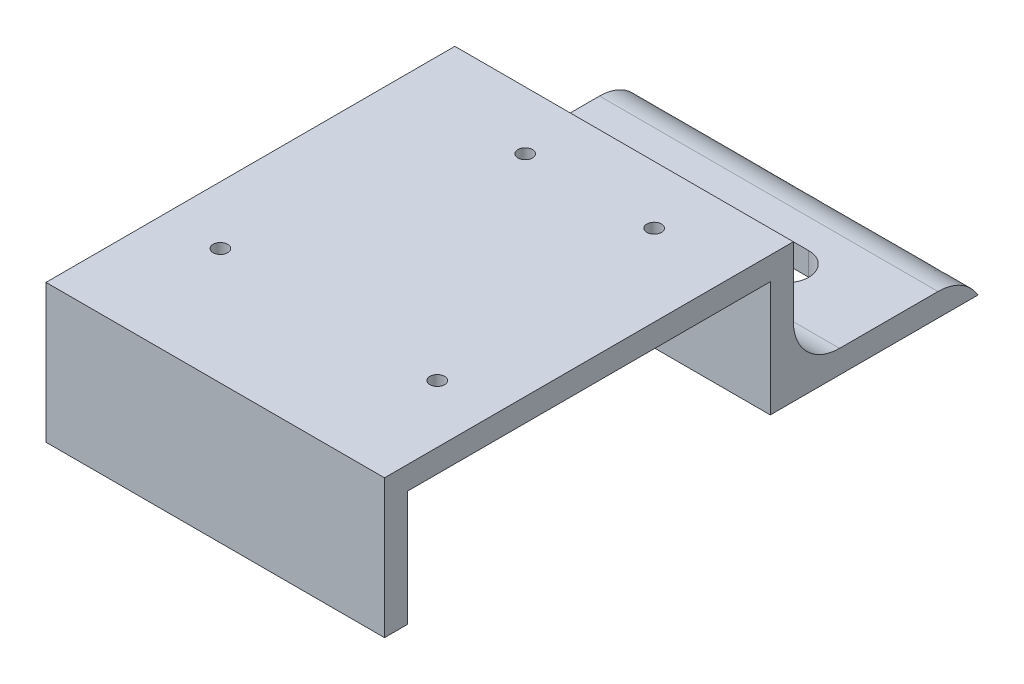
ISO-10303-21;
HEADER;
FILE_DESCRIPTION(('STEP AP214'),'2;1');
FILE_NAME('part.step','',(''),(''),'','','');
FILE_SCHEMA(('AUTOMOTIVE_DESIGN { 1 0 10303 214 1 1 1 1 }'));
ENDSEC;
DATA;
#1=APPLICATION_CONTEXT('core data for automotive mechanical design processes');
#2=APPLICATION_PROTOCOL_DEFINITION('international standard','automotive_design',2000,#1);
#3=PRODUCT_CONTEXT('',#1,'mechanical');
#4=PRODUCT('Part','Part','',(#3));
#5=PRODUCT_RELATED_PRODUCT_CATEGORY('part','',(#4));
#6=PRODUCT_DEFINITION_FORMATION('','',#4);
#7=PRODUCT_DEFINITION_CONTEXT('part definition',#1,'design');
#8=PRODUCT_DEFINITION('design','',#6,#7);
#9=PRODUCT_DEFINITION_SHAPE('','',#8);
#10=(LENGTH_UNIT() NAMED_UNIT(*) SI_UNIT(.MILLI.,.METRE.));
#11=(NAMED_UNIT(*) PLANE_ANGLE_UNIT() SI_UNIT($,.RADIAN.));
#12=(NAMED_UNIT(*) SI_UNIT($,.STERADIAN.) SOLID_ANGLE_UNIT());
#13=UNCERTAINTY_MEASURE_WITH_UNIT(LENGTH_MEASURE(1.E-05),#10,'distance_accuracy_value','');
#14=(GEOMETRIC_REPRESENTATION_CONTEXT(3) GLOBAL_UNCERTAINTY_ASSIGNED_CONTEXT((#13)) GLOBAL_UNIT_ASSIGNED_CONTEXT((#10,
#11,#12)) REPRESENTATION_CONTEXT('',''));
#15=CARTESIAN_POINT('',(0.,0.,0.));
#16=DIRECTION('',(0.,0.,1.));
#17=DIRECTION('',(1.,0.,0.));
#18=AXIS2_PLACEMENT_3D('',#15,#16,#17);
#19=CARTESIAN_POINT('',(10.,5.,-78.58));
#20=DIRECTION('',(0.,0.,1.));
#21=DIRECTION('',(1.,0.,0.));
#22=AXIS2_PLACEMENT_3D('',#19,#20,#21);
#23=PLANE('',#22);
#24=DIRECTION('',(0.,-1.,0.));
#25=VECTOR('',#24,1.);
#26=CARTESIAN_POINT('',(10.,5.,-78.58));
#27=LINE('',#26,#25);
#28=CARTESIAN_POINT('',(10.,5.,-78.58));
#29=VERTEX_POINT('',#28);
#30=CARTESIAN_POINT('',(10.,-10.,-78.58));
#31=VERTEX_POINT('',#30);
#32=EDGE_CURVE('E308',#29,#31,#27,.T.);
#33=ORIENTED_EDGE('',*,*,#32,.T.);
#34=CARTESIAN_POINT('',(-210.02,-9.99999999999999,-78.58));
#35=CARTESIAN_POINT('',(-161.126666666667,-10.,-78.58));
#36=CARTESIAN_POINT('',(-112.233333333333,-10.,-78.58));
#37=CARTESIAN_POINT('',(-63.34,-10.,-78.58));
#38=CARTESIAN_POINT('',(-38.8933333333333,-10.,-78.58));
#39=CARTESIAN_POINT('',(-14.4466666666667,-10.,-78.58));
#40=CARTESIAN_POINT('',(10.,-10.,-78.58));
#41=CARTESIAN_POINT('',(58.8933333333334,-10.,-78.58));
#42=CARTESIAN_POINT('',(107.786666666667,-10.,-78.58));
#43=CARTESIAN_POINT('',(156.68,-10.,-78.58));
#44=(BOUNDED_CURVE() B_SPLINE_CURVE(3,(#34,#35,#36,#37,#38,#39,#40,#41,#42,#43),.UNSPECIFIED.,
.F.,.F.) B_SPLINE_CURVE_WITH_KNOTS((4,3,3,4),(-0.22002,-0.07334,0.,0.14668),
.UNSPECIFIED.) CURVE() GEOMETRIC_REPRESENTATION_ITEM() RATIONAL_B_SPLINE_CURVE((1.,1.,1.,1.,1.,
1.,1.,1.,1.,1.)) REPRESENTATION_ITEM(''));
#45=CARTESIAN_POINT('',(-63.34,-10.,-78.58));
#46=VERTEX_POINT('',#45);
#47=EDGE_CURVE('E68',#31,#46,#44,.F.);
#48=ORIENTED_EDGE('',*,*,#47,.T.);
#49=DIRECTION('',(0.,-1.,0.));
#50=VECTOR('',#49,1.);
#51=CARTESIAN_POINT('',(-63.34,5.,-78.58));
#52=LINE('',#51,#50);
#53=CARTESIAN_POINT('',(-63.34,5.,-78.58));
#54=VERTEX_POINT('',#53);
#55=EDGE_CURVE('E312',#54,#46,#52,.T.);
#56=ORIENTED_EDGE('',*,*,#55,.F.);
#57=DIRECTION('',(-1.,0.,0.));
#58=VECTOR('',#57,1.);
#59=CARTESIAN_POINT('',(10.,5.,-78.58));
#60=LINE('',#59,#58);
#61=EDGE_CURVE('E309',#29,#54,#60,.T.);
#62=ORIENTED_EDGE('',*,*,#61,.F.);
#63=EDGE_LOOP('',(#33,#48,#56,#62));
#64=FACE_BOUND('',#63,.T.);
#65=ADVANCED_FACE('F38',(#64),#23,.F.);
#66=CARTESIAN_POINT('',(0.,0.,0.));
#67=DIRECTION('',(0.,-1.,0.));
#68=DIRECTION('',(0.,0.,-1.));
#69=AXIS2_PLACEMENT_3D('',#66,#67,#68);
#70=PLANE('',#69);
#71=CARTESIAN_POINT('',(-50.8,0.,-15.24));
#72=DIRECTION('',(0.,1.,0.));
#73=DIRECTION('',(0.,0.,1.));
#74=AXIS2_PLACEMENT_3D('',#71,#72,#73);
#75=CIRCLE('',#74,1.5875);
#76=CARTESIAN_POINT('',(-50.8,0.,-13.6525));
#77=VERTEX_POINT('',#76);
#78=EDGE_CURVE('E383',#77,#77,#75,.T.);
#79=ORIENTED_EDGE('',*,*,#78,.T.);
#80=EDGE_LOOP('',(#79));
#81=FACE_BOUND('',#80,.T.);
#82=CARTESIAN_POINT('',(-2.54,0.,-13.97));
#83=DIRECTION('',(0.,1.,0.));
#84=DIRECTION('',(0.,0.,1.));
#85=AXIS2_PLACEMENT_3D('',#82,#83,#84);
#86=CIRCLE('',#85,1.5875);
#87=CARTESIAN_POINT('',(-2.54,0.,-12.3825));
#88=VERTEX_POINT('',#87);
#89=EDGE_CURVE('E388',#88,#88,#86,.T.);
#90=ORIENTED_EDGE('',*,*,#89,.T.);
#91=EDGE_LOOP('',(#90));
#92=FACE_BOUND('',#91,.T.);
#93=CARTESIAN_POINT('',(-35.56,0.,-66.04));
#94=DIRECTION('',(0.,1.,0.));
#95=DIRECTION('',(0.,0.,1.));
#96=AXIS2_PLACEMENT_3D('',#93,#94,#95);
#97=CIRCLE('',#96,1.5875);
#98=CARTESIAN_POINT('',(-35.56,0.,-64.4525));
#99=VERTEX_POINT('',#98);
#100=EDGE_CURVE('E384',#99,#99,#97,.T.);
#101=ORIENTED_EDGE('',*,*,#100,.T.);
#102=EDGE_LOOP('',(#101));
#103=FACE_BOUND('',#102,.T.);
#104=CARTESIAN_POINT('',(-7.62,0.,-66.04));
#105=DIRECTION('',(0.,1.,0.));
#106=DIRECTION('',(0.,0.,1.));
#107=AXIS2_PLACEMENT_3D('',#104,#105,#106);
#108=CIRCLE('',#107,1.5875);
#109=CARTESIAN_POINT('',(-7.62,0.,-64.4525));
#110=VERTEX_POINT('',#109);
#111=EDGE_CURVE('E387',#110,#110,#108,.T.);
#112=ORIENTED_EDGE('',*,*,#111,.T.);
#113=EDGE_LOOP('',(#112));
#114=FACE_BOUND('',#113,.T.);
#115=DIRECTION('',(0.,0.,-1.));
#116=VECTOR('',#115,1.);
#117=CARTESIAN_POINT('',(10.,0.,10.));
#118=LINE('',#117,#116);
#119=CARTESIAN_POINT('',(10.,0.,5.00000000000001));
#120=VERTEX_POINT('',#119);
#121=CARTESIAN_POINT('',(10.,0.,-73.58));
#122=VERTEX_POINT('',#121);
#123=EDGE_CURVE('E412',#120,#122,#118,.T.);
#124=ORIENTED_EDGE('',*,*,#123,.F.);
#125=DIRECTION('',(1.,0.,0.));
#126=VECTOR('',#125,1.);
#127=CARTESIAN_POINT('',(-63.34,0.,5.00000000000001));
#128=LINE('',#127,#126);
#129=CARTESIAN_POINT('',(-63.34,0.,5.00000000000001));
#130=VERTEX_POINT('',#129);
#131=EDGE_CURVE('E324',#130,#120,#128,.T.);
#132=ORIENTED_EDGE('',*,*,#131,.F.);
#133=DIRECTION('',(0.,0.,-1.));
#134=VECTOR('',#133,1.);
#135=CARTESIAN_POINT('',(-63.34,0.,10.));
#136=LINE('',#135,#134);
#137=CARTESIAN_POINT('',(-63.34,0.,-73.58));
#138=VERTEX_POINT('',#137);
#139=EDGE_CURVE('E407',#130,#138,#136,.T.);
#140=ORIENTED_EDGE('',*,*,#139,.T.);
#141=DIRECTION('',(-1.,0.,0.));
#142=VECTOR('',#141,1.);
#143=CARTESIAN_POINT('',(-63.34,0.,-73.58));
#144=LINE('',#143,#142);
#145=EDGE_CURVE('E371',#122,#138,#144,.T.);
#146=ORIENTED_EDGE('',*,*,#145,.F.);
#147=EDGE_LOOP('',(#124,#132,#140,#146));
#148=FACE_BOUND('',#147,.T.);
#149=ADVANCED_FACE('F232',(#81,#92,#103,#114,#148),#70,.T.);
#150=CARTESIAN_POINT('',(10.,5.,10.));
#151=DIRECTION('',(0.,0.,1.));
#152=DIRECTION('',(1.,0.,0.));
#153=AXIS2_PLACEMENT_3D('',#150,#151,#152);
#154=PLANE('',#153);
#155=DIRECTION('',(0.,-1.,0.));
#156=VECTOR('',#155,1.);
#157=CARTESIAN_POINT('',(-63.34,5.,10.));
#158=LINE('',#157,#156);
#159=CARTESIAN_POINT('',(-63.34,5.,10.));
#160=VERTEX_POINT('',#159);
#161=CARTESIAN_POINT('',(-63.34,-25.,10.));
#162=VERTEX_POINT('',#161);
#163=EDGE_CURVE('E208',#160,#162,#158,.T.);
#164=ORIENTED_EDGE('',*,*,#163,.T.);
#165=DIRECTION('',(-1.,0.,0.));
#166=VECTOR('',#165,1.);
#167=CARTESIAN_POINT('',(10.,-25.,10.));
#168=LINE('',#167,#166);
#169=CARTESIAN_POINT('',(10.,-25.,10.));
#170=VERTEX_POINT('',#169);
#171=EDGE_CURVE('E327',#170,#162,#168,.T.);
#172=ORIENTED_EDGE('',*,*,#171,.F.);
#173=DIRECTION('',(0.,-1.,0.));
#174=VECTOR('',#173,1.);
#175=CARTESIAN_POINT('',(10.,5.,10.));
#176=LINE('',#175,#174);
#177=CARTESIAN_POINT('',(10.,5.,10.));
#178=VERTEX_POINT('',#177);
#179=EDGE_CURVE('E311',#178,#170,#176,.T.);
#180=ORIENTED_EDGE('',*,*,#179,.F.);
#181=DIRECTION('',(-1.,0.,0.));
#182=VECTOR('',#181,1.);
#183=CARTESIAN_POINT('',(10.,5.,10.));
#184=LINE('',#183,#182);
#185=EDGE_CURVE('E408',#178,#160,#184,.T.);
#186=ORIENTED_EDGE('',*,*,#185,.T.);
#187=EDGE_LOOP('',(#164,#172,#180,#186));
#188=FACE_BOUND('',#187,.T.);
#189=ADVANCED_FACE('F231',(#188),#154,.T.);
#190=CARTESIAN_POINT('',(10.,5.,10.));
#191=DIRECTION('',(-1.,0.,0.));
#192=DIRECTION('',(0.,0.,1.));
#193=AXIS2_PLACEMENT_3D('',#190,#191,#192);
#194=PLANE('',#193);
#195=DIRECTION('',(0.,0.,1.));
#196=VECTOR('',#195,1.);
#197=CARTESIAN_POINT('',(10.,-25.,-73.58));
#198=LINE('',#197,#196);
#199=CARTESIAN_POINT('',(9.99999999999999,-25.,-118.58));
#200=VERTEX_POINT('',#199);
#201=CARTESIAN_POINT('',(10.,-25.,-73.58));
#202=VERTEX_POINT('',#201);
#203=EDGE_CURVE('E218',#200,#202,#198,.T.);
#204=ORIENTED_EDGE('',*,*,#203,.F.);
#205=CARTESIAN_POINT('',(10.,-20.,-109.919745962156));
#206=CARTESIAN_POINT('',(9.99999999999999,-20.,-115.693248654052));
#207=CARTESIAN_POINT('',(9.99999999999999,-25.,-118.58));
#208=(BOUNDED_CURVE() B_SPLINE_CURVE(2,(#205,#206,#207),.UNSPECIFIED.,.F.,
.F.) B_SPLINE_CURVE_WITH_KNOTS((3,3),(0.,1.),
.UNSPECIFIED.) CURVE() GEOMETRIC_REPRESENTATION_ITEM() RATIONAL_B_SPLINE_CURVE((1.,
0.866025403784439,1.)) REPRESENTATION_ITEM(''));
#209=CARTESIAN_POINT('',(9.99999999999999,-20.,-109.919745962156));
#210=VERTEX_POINT('',#209);
#211=EDGE_CURVE('E212',#200,#210,#208,.F.);
#212=ORIENTED_EDGE('',*,*,#211,.T.);
#213=DIRECTION('',(0.,0.,1.));
#214=VECTOR('',#213,1.);
#215=CARTESIAN_POINT('',(9.99999999999999,-20.,-118.58));
#216=LINE('',#215,#214);
#217=CARTESIAN_POINT('',(10.,-20.,-88.58));
#218=VERTEX_POINT('',#217);
#219=EDGE_CURVE('E204',#210,#218,#216,.T.);
#220=ORIENTED_EDGE('',*,*,#219,.T.);
#221=CARTESIAN_POINT('',(10.,-20.,-88.58));
#222=CARTESIAN_POINT('',(10.,-20.000030243782,-88.2987394086294));
#223=CARTESIAN_POINT('',(10.,-19.9881351412365,-88.0174831608804));
#224=CARTESIAN_POINT('',(10.,-19.9407126842738,-87.4569829879485));
#225=CARTESIAN_POINT('',(10.,-19.9051864634849,-87.177738966885));
#226=CARTESIAN_POINT('',(10.,-19.8107558621721,-86.6234490123563));
#227=CARTESIAN_POINT('',(10.,-19.7518691668823,-86.3484000661787));
#228=CARTESIAN_POINT('',(10.,-19.6111459958113,-85.8042409682999));
#229=CARTESIAN_POINT('',(10.,-19.529309800179,-85.535130744147));
#230=CARTESIAN_POINT('',(10.,-19.3432216940754,-85.004630965642));
#231=CARTESIAN_POINT('',(10.,-19.2389591118716,-84.7432451545858));
#232=CARTESIAN_POINT('',(10.,-19.0087808876758,-84.2301813919526));
#233=CARTESIAN_POINT('',(10.,-18.8828647877046,-83.9785036458424));
#234=CARTESIAN_POINT('',(10.,-18.610301372502,-83.4866968361682));
#235=CARTESIAN_POINT('',(10.,-18.4636578817249,-83.2465656530534));
#236=CARTESIAN_POINT('',(10.,-18.1506654585722,-82.7795105128233));
#237=CARTESIAN_POINT('',(10.,-17.9843166323574,-82.5525864845653));
#238=CARTESIAN_POINT('',(10.,-17.6330965634878,-82.1135588232172));
#239=CARTESIAN_POINT('',(10.,-17.4482254522391,-81.9014550850028));
#240=CARTESIAN_POINT('',(10.,-17.0612739280054,-81.4935738749011));
#241=CARTESIAN_POINT('',(10.,-16.8591935146296,-81.2977964033847));
#242=CARTESIAN_POINT('',(10.,-16.4392168814837,-80.9239212007128));
#243=CARTESIAN_POINT('',(10.,-16.2213174490276,-80.745827078357));
#244=CARTESIAN_POINT('',(10.,-15.7712923694028,-80.4086329512801));
#245=CARTESIAN_POINT('',(10.,-15.5391669412312,-80.2495326542764));
#246=CARTESIAN_POINT('',(10.,-15.0622858327539,-79.9514225883191));
#247=CARTESIAN_POINT('',(10.,-14.8175274854212,-79.8124170854607));
#248=CARTESIAN_POINT('',(10.,-14.3171746784549,-79.5555280479117));
#249=CARTESIAN_POINT('',(10.,-14.0615803993028,-79.4376441615938));
#250=CARTESIAN_POINT('',(10.,-13.5414762201447,-79.2238821155476));
#251=CARTESIAN_POINT('',(10.,-13.2769704678346,-79.127993876253));
#252=CARTESIAN_POINT('',(10.,-12.7409265033633,-78.9588596600932));
#253=CARTESIAN_POINT('',(10.,-12.4693899987335,-78.8856082403888));
#254=CARTESIAN_POINT('',(10.,-11.8350735853804,-78.7428974788904));
#255=CARTESIAN_POINT('',(10.,-11.4703549279125,-78.6818129448116));
#256=CARTESIAN_POINT('',(10.,-10.9203488802216,-78.6207323685772));
#257=CARTESIAN_POINT('',(10.,-10.7366189268432,-78.6054632274793));
#258=CARTESIAN_POINT('',(10.,-10.3686077135829,-78.5850982707273));
#259=CARTESIAN_POINT('',(10.,-10.1843264895054,-78.5800018081456));
#260=CARTESIAN_POINT('',(10.,-10.,-78.58));
#261=B_SPLINE_CURVE_WITH_KNOTS('',3,(#221,#222,#223,#224,#225,#226,#227,#228,#229,#230,#231,
#232,#233,#234,#235,#236,#237,#238,#239,#240,#241,#242,#243,#244,#245,#246,#247,#248,#249,#250,
#251,#252,#253,#254,#255,#256,#257,#258,#259,#260),.UNSPECIFIED.,.F.,.F.,(4,2,2,2,2,2,2,2,2,2,2,
2,2,2,2,2,2,2,2,4),(0.,0.843524225534214,1.68700798857623,2.52985440039547,3.37269052387659,
4.21592860686618,5.05918452682156,5.90228505847174,6.74538104819433,7.58847105701002,
8.43156108497183,9.27482281775598,10.1180715725067,10.9614990856436,11.804912556303,
12.6479387548296,13.4907620965666,14.5975846256286,15.1504384772058,15.7032571691341),.UNSPECIFIED.);
#262=EDGE_CURVE('E55',#218,#31,#261,.T.);
#263=ORIENTED_EDGE('',*,*,#262,.T.);
#264=ORIENTED_EDGE('',*,*,#32,.F.);
#265=DIRECTION('',(0.,0.,-1.));
#266=VECTOR('',#265,1.);
#267=CARTESIAN_POINT('',(10.,5.,10.));
#268=LINE('',#267,#266);
#269=EDGE_CURVE('E415',#178,#29,#268,.T.);
#270=ORIENTED_EDGE('',*,*,#269,.F.);
#271=ORIENTED_EDGE('',*,*,#179,.T.);
#272=DIRECTION('',(0.,0.,1.));
#273=VECTOR('',#272,1.);
#274=CARTESIAN_POINT('',(10.,-25.,5.00000000000001));
#275=LINE('',#274,#273);
#276=CARTESIAN_POINT('',(10.,-25.,5.00000000000001));
#277=VERTEX_POINT('',#276);
#278=EDGE_CURVE('E360',#277,#170,#275,.T.);
#279=ORIENTED_EDGE('',*,*,#278,.F.);
#280=DIRECTION('',(0.,1.,0.));
#281=VECTOR('',#280,1.);
#282=CARTESIAN_POINT('',(10.,-25.,5.00000000000001));
#283=LINE('',#282,#281);
#284=EDGE_CURVE('E366',#277,#120,#283,.T.);
#285=ORIENTED_EDGE('',*,*,#284,.T.);
#286=ORIENTED_EDGE('',*,*,#123,.T.);
#287=DIRECTION('',(0.,1.,0.));
#288=VECTOR('',#287,1.);
#289=CARTESIAN_POINT('',(10.,-25.,-73.58));
#290=LINE('',#289,#288);
#291=EDGE_CURVE('E380',#202,#122,#290,.T.);
#292=ORIENTED_EDGE('',*,*,#291,.F.);
#293=EDGE_LOOP('',(#204,#212,#220,#263,#264,#270,#271,#279,#285,#286,#292));
#294=FACE_BOUND('',#293,.T.);
#295=ADVANCED_FACE('F220',(#294),#194,.F.);
#296=CARTESIAN_POINT('',(-63.34,5.,10.));
#297=DIRECTION('',(-1.,0.,0.));
#298=DIRECTION('',(0.,0.,1.));
#299=AXIS2_PLACEMENT_3D('',#296,#297,#298);
#300=PLANE('',#299);
#301=DIRECTION('',(0.,0.,1.));
#302=VECTOR('',#301,1.);
#303=CARTESIAN_POINT('',(-63.34,-20.,-118.58));
#304=LINE('',#303,#302);
#305=CARTESIAN_POINT('',(-63.34,-20.,-109.919745962156));
#306=VERTEX_POINT('',#305);
#307=CARTESIAN_POINT('',(-63.34,-20.,-88.58));
#308=VERTEX_POINT('',#307);
#309=EDGE_CURVE('E207',#306,#308,#304,.T.);
#310=ORIENTED_EDGE('',*,*,#309,.F.);
#311=CARTESIAN_POINT('',(-63.34,-25.,-118.58));
#312=CARTESIAN_POINT('',(-63.34,-20.,-115.693248654052));
#313=CARTESIAN_POINT('',(-63.34,-20.,-109.919745962156));
#314=(BOUNDED_CURVE() B_SPLINE_CURVE(2,(#311,#312,#313),.UNSPECIFIED.,.F.,
.F.) B_SPLINE_CURVE_WITH_KNOTS((3,3),(0.,1.),
.UNSPECIFIED.) CURVE() GEOMETRIC_REPRESENTATION_ITEM() RATIONAL_B_SPLINE_CURVE((1.,
0.866025403784439,1.)) REPRESENTATION_ITEM(''));
#315=CARTESIAN_POINT('',(-63.34,-25.,-118.58));
#316=VERTEX_POINT('',#315);
#317=EDGE_CURVE('E251',#306,#316,#314,.F.);
#318=ORIENTED_EDGE('',*,*,#317,.T.);
#319=DIRECTION('',(0.,0.,-1.));
#320=VECTOR('',#319,1.);
#321=CARTESIAN_POINT('',(-63.34,-25.,-78.58));
#322=LINE('',#321,#320);
#323=CARTESIAN_POINT('',(-63.34,-25.,-73.58));
#324=VERTEX_POINT('',#323);
#325=EDGE_CURVE('E374',#324,#316,#322,.T.);
#326=ORIENTED_EDGE('',*,*,#325,.F.);
#327=DIRECTION('',(0.,1.,0.));
#328=VECTOR('',#327,1.);
#329=CARTESIAN_POINT('',(-63.34,-25.,-73.58));
#330=LINE('',#329,#328);
#331=EDGE_CURVE('E377',#324,#138,#330,.T.);
#332=ORIENTED_EDGE('',*,*,#331,.T.);
#333=ORIENTED_EDGE('',*,*,#139,.F.);
#334=DIRECTION('',(0.,1.,0.));
#335=VECTOR('',#334,1.);
#336=CARTESIAN_POINT('',(-63.34,-25.,5.00000000000001));
#337=LINE('',#336,#335);
#338=CARTESIAN_POINT('',(-63.34,-25.,5.00000000000001));
#339=VERTEX_POINT('',#338);
#340=EDGE_CURVE('E369',#339,#130,#337,.T.);
#341=ORIENTED_EDGE('',*,*,#340,.F.);
#342=DIRECTION('',(0.,0.,-1.));
#343=VECTOR('',#342,1.);
#344=CARTESIAN_POINT('',(-63.34,-25.,10.));
#345=LINE('',#344,#343);
#346=EDGE_CURVE('E357',#162,#339,#345,.T.);
#347=ORIENTED_EDGE('',*,*,#346,.F.);
#348=ORIENTED_EDGE('',*,*,#163,.F.);
#349=DIRECTION('',(0.,0.,-1.));
#350=VECTOR('',#349,1.);
#351=CARTESIAN_POINT('',(-63.34,5.,10.));
#352=LINE('',#351,#350);
#353=EDGE_CURVE('E411',#160,#54,#352,.T.);
#354=ORIENTED_EDGE('',*,*,#353,.T.);
#355=ORIENTED_EDGE('',*,*,#55,.T.);
#356=CARTESIAN_POINT('',(-63.34,-10.,-78.58));
#357=CARTESIAN_POINT('',(-63.34,-10.2812605913706,-78.5799697562179));
#358=CARTESIAN_POINT('',(-63.34,-10.5625168391196,-78.5918648587635));
#359=CARTESIAN_POINT('',(-63.34,-11.1230170120515,-78.6392873157262));
#360=CARTESIAN_POINT('',(-63.34,-11.402261033115,-78.674813536515));
#361=CARTESIAN_POINT('',(-63.34,-11.9565509876437,-78.7692441378279));
#362=CARTESIAN_POINT('',(-63.34,-12.2315999338214,-78.8281308331176));
#363=CARTESIAN_POINT('',(-63.34,-12.7757590317001,-78.9688540041886));
#364=CARTESIAN_POINT('',(-63.34,-13.044869255853,-79.0506901998209));
#365=CARTESIAN_POINT('',(-63.34,-13.575369034358,-79.2367783059245));
#366=CARTESIAN_POINT('',(-63.34,-13.8367548454142,-79.3410408881284));
#367=CARTESIAN_POINT('',(-63.34,-14.3498186080474,-79.5712191123242));
#368=CARTESIAN_POINT('',(-63.34,-14.6014963541576,-79.6971352122954));
#369=CARTESIAN_POINT('',(-63.34,-15.0933031638318,-79.969698627498));
#370=CARTESIAN_POINT('',(-63.34,-15.3334343469466,-80.116342118275));
#371=CARTESIAN_POINT('',(-63.34,-15.8004894871767,-80.4293345414277));
#372=CARTESIAN_POINT('',(-63.34,-16.0274135154347,-80.5956833676426));
#373=CARTESIAN_POINT('',(-63.34,-16.4664411767828,-80.9469034365121));
#374=CARTESIAN_POINT('',(-63.34,-16.6785449149972,-81.1317745477609));
#375=CARTESIAN_POINT('',(-63.34,-17.0864261250989,-81.5187260719946));
#376=CARTESIAN_POINT('',(-63.34,-17.2822035966153,-81.7208064853704));
#377=CARTESIAN_POINT('',(-63.34,-17.6560787992872,-82.1407831185163));
#378=CARTESIAN_POINT('',(-63.34,-17.834172921643,-82.3586825509723));
#379=CARTESIAN_POINT('',(-63.34,-18.1713670487199,-82.8087076305971));
#380=CARTESIAN_POINT('',(-63.34,-18.3304673457235,-83.0408330587688));
#381=CARTESIAN_POINT('',(-63.34,-18.6285774116808,-83.5177141672461));
#382=CARTESIAN_POINT('',(-63.34,-18.7675829145393,-83.7624725145787));
#383=CARTESIAN_POINT('',(-63.34,-19.0244719520883,-84.262825321545));
#384=CARTESIAN_POINT('',(-63.34,-19.1423558384062,-84.5184196006972));
#385=CARTESIAN_POINT('',(-63.34,-19.3561178844524,-85.0385237798553));
#386=CARTESIAN_POINT('',(-63.34,-19.452006123747,-85.3030295321654));
#387=CARTESIAN_POINT('',(-63.34,-19.6211403399069,-85.8390734966367));
#388=CARTESIAN_POINT('',(-63.34,-19.6943917596112,-86.1106100012665));
#389=CARTESIAN_POINT('',(-63.34,-19.8371025211096,-86.7449264146196));
#390=CARTESIAN_POINT('',(-63.34,-19.8981870551884,-87.1096450720875));
#391=CARTESIAN_POINT('',(-63.34,-19.9592676314228,-87.6596511197784));
#392=CARTESIAN_POINT('',(-63.34,-19.9745367725207,-87.8433810731568));
#393=CARTESIAN_POINT('',(-63.34,-19.9949017292727,-88.211392286417));
#394=CARTESIAN_POINT('',(-63.34,-19.9999981918544,-88.3956735104945));
#395=CARTESIAN_POINT('',(-63.34,-20.,-88.58));
#396=B_SPLINE_CURVE_WITH_KNOTS('',3,(#356,#357,#358,#359,#360,#361,#362,#363,#364,#365,#366,
#367,#368,#369,#370,#371,#372,#373,#374,#375,#376,#377,#378,#379,#380,#381,#382,#383,#384,#385,
#386,#387,#388,#389,#390,#391,#392,#393,#394,#395),.UNSPECIFIED.,.F.,.F.,(4,2,2,2,2,2,2,2,2,2,2,
2,2,2,2,2,2,2,2,4),(0.,0.843524225534217,1.68700798857624,2.52985440039549,3.37269052387661,
4.21592860686619,5.05918452682156,5.90228505847176,6.74538104819433,7.58847105701001,
8.43156108497183,9.27482281775596,10.1180715725067,10.9614990856436,11.804912556303,
12.6479387548297,13.4907620965667,14.5975846256286,15.1504384772059,15.7032571691341),.UNSPECIFIED.);
#397=EDGE_CURVE('E11',#46,#308,#396,.T.);
#398=ORIENTED_EDGE('',*,*,#397,.T.);
#399=EDGE_LOOP('',(#310,#318,#326,#332,#333,#341,#347,#348,#354,#355,#398));
#400=FACE_BOUND('',#399,.T.);
#401=ADVANCED_FACE('F230',(#400),#300,.T.);
#402=CARTESIAN_POINT('',(0.,5.,0.));
#403=DIRECTION('',(0.,-1.,0.));
#404=DIRECTION('',(0.,0.,-1.));
#405=AXIS2_PLACEMENT_3D('',#402,#403,#404);
#406=PLANE('',#405);
#407=CARTESIAN_POINT('',(-50.8,5.,-15.24));
#408=DIRECTION('',(0.,-1.,0.));
#409=DIRECTION('',(0.,0.,-1.));
#410=AXIS2_PLACEMENT_3D('',#407,#408,#409);
#411=CIRCLE('',#410,1.5875);
#412=CARTESIAN_POINT('',(-50.8,5.,-16.8275));
#413=VERTEX_POINT('',#412);
#414=EDGE_CURVE('E404',#413,#413,#411,.F.);
#415=ORIENTED_EDGE('',*,*,#414,.F.);
#416=EDGE_LOOP('',(#415));
#417=FACE_BOUND('',#416,.T.);
#418=CARTESIAN_POINT('',(-2.54,5.,-13.97));
#419=DIRECTION('',(0.,-1.,0.));
#420=DIRECTION('',(0.,0.,-1.));
#421=AXIS2_PLACEMENT_3D('',#418,#419,#420);
#422=CIRCLE('',#421,1.5875);
#423=CARTESIAN_POINT('',(-2.54,5.,-15.5575));
#424=VERTEX_POINT('',#423);
#425=EDGE_CURVE('E401',#424,#424,#422,.F.);
#426=ORIENTED_EDGE('',*,*,#425,.F.);
#427=EDGE_LOOP('',(#426));
#428=FACE_BOUND('',#427,.T.);
#429=CARTESIAN_POINT('',(-35.56,5.,-66.04));
#430=DIRECTION('',(0.,-1.,0.));
#431=DIRECTION('',(0.,0.,-1.));
#432=AXIS2_PLACEMENT_3D('',#429,#430,#431);
#433=CIRCLE('',#432,1.5875);
#434=CARTESIAN_POINT('',(-35.56,5.,-67.6275));
#435=VERTEX_POINT('',#434);
#436=EDGE_CURVE('E398',#435,#435,#433,.F.);
#437=ORIENTED_EDGE('',*,*,#436,.F.);
#438=EDGE_LOOP('',(#437));
#439=FACE_BOUND('',#438,.T.);
#440=CARTESIAN_POINT('',(-7.62,5.,-66.04));
#441=DIRECTION('',(0.,-1.,0.));
#442=DIRECTION('',(0.,0.,-1.));
#443=AXIS2_PLACEMENT_3D('',#440,#441,#442);
#444=CIRCLE('',#443,1.5875);
#445=CARTESIAN_POINT('',(-7.62,5.,-67.6275));
#446=VERTEX_POINT('',#445);
#447=EDGE_CURVE('E395',#446,#446,#444,.F.);
#448=ORIENTED_EDGE('',*,*,#447,.F.);
#449=EDGE_LOOP('',(#448));
#450=FACE_BOUND('',#449,.T.);
#451=ORIENTED_EDGE('',*,*,#185,.F.);
#452=ORIENTED_EDGE('',*,*,#269,.T.);
#453=ORIENTED_EDGE('',*,*,#61,.T.);
#454=ORIENTED_EDGE('',*,*,#353,.F.);
#455=EDGE_LOOP('',(#451,#452,#453,#454));
#456=FACE_BOUND('',#455,.T.);
#457=ADVANCED_FACE('F292',(#417,#428,#439,#450,#456),#406,.F.);
#458=CARTESIAN_POINT('',(-7.62,50.,-66.04));
#459=DIRECTION('',(0.,-1.,0.));
#460=DIRECTION('',(0.,0.,-1.));
#461=AXIS2_PLACEMENT_3D('',#458,#459,#460);
#462=CYLINDRICAL_SURFACE('',#461,1.5875);
#463=ORIENTED_EDGE('',*,*,#111,.F.);
#464=EDGE_LOOP('',(#463));
#465=FACE_BOUND('',#464,.T.);
#466=ORIENTED_EDGE('',*,*,#447,.T.);
#467=EDGE_LOOP('',(#466));
#468=FACE_BOUND('',#467,.T.);
#469=ADVANCED_FACE('F283',(#465,#468),#462,.F.);
#470=CARTESIAN_POINT('',(-35.56,50.,-66.04));
#471=DIRECTION('',(0.,-1.,0.));
#472=DIRECTION('',(0.,0.,-1.));
#473=AXIS2_PLACEMENT_3D('',#470,#471,#472);
#474=CYLINDRICAL_SURFACE('',#473,1.5875);
#475=ORIENTED_EDGE('',*,*,#100,.F.);
#476=EDGE_LOOP('',(#475));
#477=FACE_BOUND('',#476,.T.);
#478=ORIENTED_EDGE('',*,*,#436,.T.);
#479=EDGE_LOOP('',(#478));
#480=FACE_BOUND('',#479,.T.);
#481=ADVANCED_FACE('F279',(#477,#480),#474,.F.);
#482=CARTESIAN_POINT('',(-2.54,50.,-13.97));
#483=DIRECTION('',(0.,-1.,0.));
#484=DIRECTION('',(0.,0.,-1.));
#485=AXIS2_PLACEMENT_3D('',#482,#483,#484);
#486=CYLINDRICAL_SURFACE('',#485,1.5875);
#487=ORIENTED_EDGE('',*,*,#89,.F.);
#488=EDGE_LOOP('',(#487));
#489=FACE_BOUND('',#488,.T.);
#490=ORIENTED_EDGE('',*,*,#425,.T.);
#491=EDGE_LOOP('',(#490));
#492=FACE_BOUND('',#491,.T.);
#493=ADVANCED_FACE('F282',(#489,#492),#486,.F.);
#494=CARTESIAN_POINT('',(-50.8,50.,-15.24));
#495=DIRECTION('',(0.,-1.,0.));
#496=DIRECTION('',(0.,0.,-1.));
#497=AXIS2_PLACEMENT_3D('',#494,#495,#496);
#498=CYLINDRICAL_SURFACE('',#497,1.5875);
#499=ORIENTED_EDGE('',*,*,#78,.F.);
#500=EDGE_LOOP('',(#499));
#501=FACE_BOUND('',#500,.T.);
#502=ORIENTED_EDGE('',*,*,#414,.T.);
#503=EDGE_LOOP('',(#502));
#504=FACE_BOUND('',#503,.T.);
#505=ADVANCED_FACE('F277',(#501,#504),#498,.F.);
#506=CARTESIAN_POINT('',(-63.34,-25.,-73.58));
#507=DIRECTION('',(0.,0.,-1.));
#508=DIRECTION('',(-1.,0.,0.));
#509=AXIS2_PLACEMENT_3D('',#506,#507,#508);
#510=PLANE('',#509);
#511=ORIENTED_EDGE('',*,*,#145,.T.);
#512=ORIENTED_EDGE('',*,*,#331,.F.);
#513=DIRECTION('',(-1.,0.,0.));
#514=VECTOR('',#513,1.);
#515=CARTESIAN_POINT('',(-63.34,-25.,-73.58));
#516=LINE('',#515,#514);
#517=EDGE_CURVE('E372',#202,#324,#516,.T.);
#518=ORIENTED_EDGE('',*,*,#517,.F.);
#519=ORIENTED_EDGE('',*,*,#291,.T.);
#520=EDGE_LOOP('',(#511,#512,#518,#519));
#521=FACE_BOUND('',#520,.T.);
#522=ADVANCED_FACE('F272',(#521),#510,.F.);
#523=CARTESIAN_POINT('',(0.,-25.,0.));
#524=DIRECTION('',(0.,1.,0.));
#525=DIRECTION('',(0.,0.,1.));
#526=AXIS2_PLACEMENT_3D('',#523,#524,#525);
#527=PLANE('',#526);
#528=DIRECTION('',(1.,0.,0.));
#529=VECTOR('',#528,1.);
#530=CARTESIAN_POINT('',(0.,-25.,-93.58));
#531=LINE('',#530,#529);
#532=CARTESIAN_POINT('',(-41.67,-25.,-93.58));
#533=VERTEX_POINT('',#532);
#534=CARTESIAN_POINT('',(-11.67,-25.,-93.58));
#535=VERTEX_POINT('',#534);
#536=EDGE_CURVE('E192',#533,#535,#531,.T.);
#537=ORIENTED_EDGE('',*,*,#536,.T.);
#538=CARTESIAN_POINT('',(-11.67,-25.,-98.58));
#539=DIRECTION('',(0.,1.,0.));
#540=DIRECTION('',(0.,0.,1.));
#541=AXIS2_PLACEMENT_3D('',#538,#539,#540);
#542=CIRCLE('',#541,5.);
#543=CARTESIAN_POINT('',(-11.67,-25.,-103.58));
#544=VERTEX_POINT('',#543);
#545=EDGE_CURVE('E195',#535,#544,#542,.T.);
#546=ORIENTED_EDGE('',*,*,#545,.T.);
#547=DIRECTION('',(-1.,0.,0.));
#548=VECTOR('',#547,1.);
#549=CARTESIAN_POINT('',(0.,-25.,-103.58));
#550=LINE('',#549,#548);
#551=CARTESIAN_POINT('',(-41.67,-25.,-103.58));
#552=VERTEX_POINT('',#551);
#553=EDGE_CURVE('E187',#544,#552,#550,.T.);
#554=ORIENTED_EDGE('',*,*,#553,.T.);
#555=CARTESIAN_POINT('',(-41.67,-25.,-98.58));
#556=DIRECTION('',(0.,1.,0.));
#557=DIRECTION('',(0.,0.,1.));
#558=AXIS2_PLACEMENT_3D('',#555,#556,#557);
#559=CIRCLE('',#558,5.);
#560=EDGE_CURVE('E162',#533,#552,#559,.F.);
#561=ORIENTED_EDGE('',*,*,#560,.F.);
#562=EDGE_LOOP('',(#537,#546,#554,#561));
#563=FACE_BOUND('',#562,.T.);
#564=ORIENTED_EDGE('',*,*,#325,.T.);
#565=CARTESIAN_POINT('',(13.667,-25.,-118.58));
#566=CARTESIAN_POINT('',(-13.2243333333334,-25.,-118.58));
#567=CARTESIAN_POINT('',(-40.1156666666667,-25.,-118.58));
#568=CARTESIAN_POINT('',(-67.007,-25.,-118.58));
#569=(BOUNDED_CURVE() B_SPLINE_CURVE(3,(#565,#566,#567,#568),.UNSPECIFIED.,.F.,
.F.) B_SPLINE_CURVE_WITH_KNOTS((4,4),(-0.077007,0.003667),
.UNSPECIFIED.) CURVE() GEOMETRIC_REPRESENTATION_ITEM() RATIONAL_B_SPLINE_CURVE((1.,1.,1.,1.)) REPRESENTATION_ITEM(''));
#570=EDGE_CURVE('E198',#200,#316,#569,.T.);
#571=ORIENTED_EDGE('',*,*,#570,.F.);
#572=ORIENTED_EDGE('',*,*,#203,.T.);
#573=ORIENTED_EDGE('',*,*,#517,.T.);
#574=EDGE_LOOP('',(#564,#571,#572,#573));
#575=FACE_BOUND('',#574,.T.);
#576=ADVANCED_FACE('F261',(#563,#575),#527,.F.);
#577=CARTESIAN_POINT('',(-63.34,-25.,5.00000000000001));
#578=DIRECTION('',(0.,0.,1.));
#579=DIRECTION('',(1.,0.,0.));
#580=AXIS2_PLACEMENT_3D('',#577,#578,#579);
#581=PLANE('',#580);
#582=ORIENTED_EDGE('',*,*,#131,.T.);
#583=ORIENTED_EDGE('',*,*,#284,.F.);
#584=DIRECTION('',(1.,0.,0.));
#585=VECTOR('',#584,1.);
#586=CARTESIAN_POINT('',(-63.34,-25.,5.00000000000001));
#587=LINE('',#586,#585);
#588=EDGE_CURVE('E362',#339,#277,#587,.T.);
#589=ORIENTED_EDGE('',*,*,#588,.F.);
#590=ORIENTED_EDGE('',*,*,#340,.T.);
#591=EDGE_LOOP('',(#582,#583,#589,#590));
#592=FACE_BOUND('',#591,.T.);
#593=ADVANCED_FACE('F271',(#592),#581,.F.);
#594=CARTESIAN_POINT('',(0.,-25.,0.));
#595=DIRECTION('',(0.,-1.,0.));
#596=DIRECTION('',(0.,0.,-1.));
#597=AXIS2_PLACEMENT_3D('',#594,#595,#596);
#598=PLANE('',#597);
#599=ORIENTED_EDGE('',*,*,#171,.T.);
#600=ORIENTED_EDGE('',*,*,#346,.T.);
#601=ORIENTED_EDGE('',*,*,#588,.T.);
#602=ORIENTED_EDGE('',*,*,#278,.T.);
#603=EDGE_LOOP('',(#599,#600,#601,#602));
#604=FACE_BOUND('',#603,.T.);
#605=ADVANCED_FACE('F345',(#604),#598,.T.);
#606=CARTESIAN_POINT('',(9.99999999999999,-20.,-118.58));
#607=DIRECTION('',(0.,-1.,0.));
#608=DIRECTION('',(1.,0.,0.));
#609=AXIS2_PLACEMENT_3D('',#606,#607,#608);
#610=PLANE('',#609);
#611=DIRECTION('',(-1.,0.,0.));
#612=VECTOR('',#611,1.);
#613=CARTESIAN_POINT('',(-11.67,-20.,-103.58));
#614=LINE('',#613,#612);
#615=CARTESIAN_POINT('',(-11.67,-20.,-103.58));
#616=VERTEX_POINT('',#615);
#617=CARTESIAN_POINT('',(-41.67,-20.,-103.58));
#618=VERTEX_POINT('',#617);
#619=EDGE_CURVE('E170',#616,#618,#614,.T.);
#620=ORIENTED_EDGE('',*,*,#619,.F.);
#621=CARTESIAN_POINT('',(-11.67,-20.,-98.58));
#622=DIRECTION('',(0.,1.,0.));
#623=DIRECTION('',(-1.,0.,0.));
#624=AXIS2_PLACEMENT_3D('',#621,#622,#623);
#625=CIRCLE('',#624,5.);
#626=CARTESIAN_POINT('',(-11.67,-20.,-93.58));
#627=VERTEX_POINT('',#626);
#628=EDGE_CURVE('E175',#627,#616,#625,.T.);
#629=ORIENTED_EDGE('',*,*,#628,.F.);
#630=DIRECTION('',(1.,0.,0.));
#631=VECTOR('',#630,1.);
#632=CARTESIAN_POINT('',(-41.67,-20.,-93.58));
#633=LINE('',#632,#631);
#634=CARTESIAN_POINT('',(-41.67,-20.,-93.58));
#635=VERTEX_POINT('',#634);
#636=EDGE_CURVE('E180',#635,#627,#633,.T.);
#637=ORIENTED_EDGE('',*,*,#636,.F.);
#638=CARTESIAN_POINT('',(-41.67,-20.,-98.58));
#639=DIRECTION('',(0.,-1.,0.));
#640=DIRECTION('',(1.,0.,0.));
#641=AXIS2_PLACEMENT_3D('',#638,#639,#640);
#642=CIRCLE('',#641,5.);
#643=EDGE_CURVE('E159',#635,#618,#642,.T.);
#644=ORIENTED_EDGE('',*,*,#643,.T.);
#645=EDGE_LOOP('',(#620,#629,#637,#644));
#646=FACE_BOUND('',#645,.T.);
#647=ORIENTED_EDGE('',*,*,#309,.T.);
#648=CARTESIAN_POINT('',(-210.02,-20.,-88.58));
#649=CARTESIAN_POINT('',(-161.126666666667,-20.,-88.58));
#650=CARTESIAN_POINT('',(-112.233333333333,-20.,-88.58));
#651=CARTESIAN_POINT('',(-63.34,-20.,-88.58));
#652=CARTESIAN_POINT('',(-38.8933333333333,-20.,-88.58));
#653=CARTESIAN_POINT('',(-14.4466666666667,-20.,-88.58));
#654=CARTESIAN_POINT('',(10.,-20.,-88.58));
#655=CARTESIAN_POINT('',(58.8933333333334,-20.,-88.58));
#656=CARTESIAN_POINT('',(107.786666666667,-20.,-88.58));
#657=CARTESIAN_POINT('',(156.68,-20.,-88.58));
#658=(BOUNDED_CURVE() B_SPLINE_CURVE(3,(#648,#649,#650,#651,#652,#653,#654,#655,#656,#657),
.UNSPECIFIED.,.F.,.F.) B_SPLINE_CURVE_WITH_KNOTS((4,3,3,4),(-0.22002,-0.07334,0.,0.14668),
.UNSPECIFIED.) CURVE() GEOMETRIC_REPRESENTATION_ITEM() RATIONAL_B_SPLINE_CURVE((1.,1.,1.,1.,1.,
1.,1.,1.,1.,1.)) REPRESENTATION_ITEM(''));
#659=EDGE_CURVE('E243',#308,#218,#658,.T.);
#660=ORIENTED_EDGE('',*,*,#659,.T.);
#661=ORIENTED_EDGE('',*,*,#219,.F.);
#662=CARTESIAN_POINT('',(-67.007,-20.,-109.919745962156));
#663=CARTESIAN_POINT('',(-40.1156666666667,-20.,-109.919745962156));
#664=CARTESIAN_POINT('',(-13.2243333333334,-20.,-109.919745962156));
#665=CARTESIAN_POINT('',(13.667,-20.,-109.919745962156));
#666=(BOUNDED_CURVE() B_SPLINE_CURVE(3,(#662,#663,#664,#665),.UNSPECIFIED.,.F.,
.F.) B_SPLINE_CURVE_WITH_KNOTS((4,4),(-0.077007,0.003667),
.UNSPECIFIED.) CURVE() GEOMETRIC_REPRESENTATION_ITEM() RATIONAL_B_SPLINE_CURVE((1.,1.,1.,1.)) REPRESENTATION_ITEM(''));
#667=EDGE_CURVE('E322',#210,#306,#666,.F.);
#668=ORIENTED_EDGE('',*,*,#667,.T.);
#669=EDGE_LOOP('',(#647,#660,#661,#668));
#670=FACE_BOUND('',#669,.T.);
#671=ADVANCED_FACE('F177',(#646,#670),#610,.F.);
#672=CARTESIAN_POINT('',(-11.67,-60.,-98.58));
#673=DIRECTION('',(0.,1.,0.));
#674=DIRECTION('',(-1.,0.,0.));
#675=AXIS2_PLACEMENT_3D('',#672,#673,#674);
#676=CYLINDRICAL_SURFACE('',#675,5.);
#677=DIRECTION('',(0.,1.,0.));
#678=VECTOR('',#677,1.);
#679=CARTESIAN_POINT('',(-11.67,-60.,-93.58));
#680=LINE('',#679,#678);
#681=EDGE_CURVE('E185',#535,#627,#680,.T.);
#682=ORIENTED_EDGE('',*,*,#681,.T.);
#683=ORIENTED_EDGE('',*,*,#628,.T.);
#684=DIRECTION('',(0.,1.,0.));
#685=VECTOR('',#684,1.);
#686=CARTESIAN_POINT('',(-11.67,-60.,-103.58));
#687=LINE('',#686,#685);
#688=EDGE_CURVE('E166',#544,#616,#687,.T.);
#689=ORIENTED_EDGE('',*,*,#688,.F.);
#690=ORIENTED_EDGE('',*,*,#545,.F.);
#691=EDGE_LOOP('',(#682,#683,#689,#690));
#692=FACE_BOUND('',#691,.T.);
#693=ADVANCED_FACE('F344',(#692),#676,.F.);
#694=CARTESIAN_POINT('',(-41.67,-60.,-93.58));
#695=DIRECTION('',(0.,0.,1.));
#696=DIRECTION('',(0.,-1.,0.));
#697=AXIS2_PLACEMENT_3D('',#694,#695,#696);
#698=PLANE('',#697);
#699=DIRECTION('',(0.,1.,0.));
#700=VECTOR('',#699,1.);
#701=CARTESIAN_POINT('',(-41.67,-60.,-93.58));
#702=LINE('',#701,#700);
#703=EDGE_CURVE('E165',#533,#635,#702,.T.);
#704=ORIENTED_EDGE('',*,*,#703,.T.);
#705=ORIENTED_EDGE('',*,*,#636,.T.);
#706=ORIENTED_EDGE('',*,*,#681,.F.);
#707=ORIENTED_EDGE('',*,*,#536,.F.);
#708=EDGE_LOOP('',(#704,#705,#706,#707));
#709=FACE_BOUND('',#708,.T.);
#710=ADVANCED_FACE('F545',(#709),#698,.F.);
#711=CARTESIAN_POINT('',(-41.67,-60.,-98.58));
#712=DIRECTION('',(0.,1.,0.));
#713=DIRECTION('',(-1.,0.,0.));
#714=AXIS2_PLACEMENT_3D('',#711,#712,#713);
#715=CYLINDRICAL_SURFACE('',#714,5.);
#716=ORIENTED_EDGE('',*,*,#560,.T.);
#717=DIRECTION('',(0.,1.,0.));
#718=VECTOR('',#717,1.);
#719=CARTESIAN_POINT('',(-41.67,-60.,-103.58));
#720=LINE('',#719,#718);
#721=EDGE_CURVE('E154',#552,#618,#720,.T.);
#722=ORIENTED_EDGE('',*,*,#721,.T.);
#723=ORIENTED_EDGE('',*,*,#643,.F.);
#724=ORIENTED_EDGE('',*,*,#703,.F.);
#725=EDGE_LOOP('',(#716,#722,#723,#724));
#726=FACE_BOUND('',#725,.T.);
#727=ADVANCED_FACE('F156',(#726),#715,.F.);
#728=CARTESIAN_POINT('',(-11.67,-60.,-103.58));
#729=DIRECTION('',(0.,0.,-1.));
#730=DIRECTION('',(0.,1.,0.));
#731=AXIS2_PLACEMENT_3D('',#728,#729,#730);
#732=PLANE('',#731);
#733=ORIENTED_EDGE('',*,*,#688,.T.);
#734=ORIENTED_EDGE('',*,*,#619,.T.);
#735=ORIENTED_EDGE('',*,*,#721,.F.);
#736=ORIENTED_EDGE('',*,*,#553,.F.);
#737=EDGE_LOOP('',(#733,#734,#735,#736));
#738=FACE_BOUND('',#737,.T.);
#739=ADVANCED_FACE('F171',(#738),#732,.F.);
#740=CARTESIAN_POINT('',(-67.007,-25.,-118.58));
#741=CARTESIAN_POINT('',(-40.1156666666667,-25.,-118.58));
#742=CARTESIAN_POINT('',(-13.2243333333334,-25.,-118.58));
#743=CARTESIAN_POINT('',(13.667,-25.,-118.58));
#744=CARTESIAN_POINT('',(-67.007,-20.,-115.693248654052));
#745=CARTESIAN_POINT('',(-40.1156666666667,-20.,-115.693248654052));
#746=CARTESIAN_POINT('',(-13.2243333333334,-20.,-115.693248654052));
#747=CARTESIAN_POINT('',(13.667,-20.,-115.693248654052));
#748=CARTESIAN_POINT('',(-67.007,-20.,-109.919745962156));
#749=CARTESIAN_POINT('',(-40.1156666666667,-20.,-109.919745962156));
#750=CARTESIAN_POINT('',(-13.2243333333334,-20.,-109.919745962156));
#751=CARTESIAN_POINT('',(13.667,-20.,-109.919745962156));
#752=(BOUNDED_SURFACE() B_SPLINE_SURFACE(2,3,((#740,#741,#742,#743),(#744,#745,#746,#747),(#748,
#749,#750,#751)),.UNSPECIFIED.,.F.,.F.,.F.) B_SPLINE_SURFACE_WITH_KNOTS((3,3),(4,4),(0.,1.),
(-0.077007,0.003667),
.UNSPECIFIED.) GEOMETRIC_REPRESENTATION_ITEM() RATIONAL_B_SPLINE_SURFACE(((1.,1.,1.,1.),
(0.866025403784439,0.866025403784439,0.866025403784439,0.866025403784439),(1.,1.,1.,1.))) REPRESENTATION_ITEM('') SURFACE());
#753=ORIENTED_EDGE('',*,*,#317,.F.);
#754=ORIENTED_EDGE('',*,*,#667,.F.);
#755=ORIENTED_EDGE('',*,*,#211,.F.);
#756=ORIENTED_EDGE('',*,*,#570,.T.);
#757=EDGE_LOOP('',(#753,#754,#755,#756));
#758=FACE_BOUND('',#757,.T.);
#759=ADVANCED_FACE('F435',(#758),#752,.T.);
#760=CARTESIAN_POINT('',(-78.0080000000001,-20.,-88.58));
#761=CARTESIAN_POINT('',(-73.1186666666667,-20.,-88.58));
#762=CARTESIAN_POINT('',(-68.2293333333333,-20.,-88.58));
#763=CARTESIAN_POINT('',(-63.34,-20.,-88.58));
#764=CARTESIAN_POINT('',(-38.8933333333333,-20.,-88.58));
#765=CARTESIAN_POINT('',(-14.4466666666667,-20.,-88.58));
#766=CARTESIAN_POINT('',(10.,-20.,-88.58));
#767=CARTESIAN_POINT('',(14.8893333333333,-20.,-88.58));
#768=CARTESIAN_POINT('',(19.7786666666667,-20.,-88.58));
#769=CARTESIAN_POINT('',(24.668,-20.,-88.58));
#770=CARTESIAN_POINT('',(-78.008,-20.,-78.5799999999999));
#771=CARTESIAN_POINT('',(-73.1186666666667,-20.,-78.5799999999999));
#772=CARTESIAN_POINT('',(-68.2293333333333,-20.,-78.5799999999999));
#773=CARTESIAN_POINT('',(-63.34,-20.,-78.58));
#774=CARTESIAN_POINT('',(-38.8933333333333,-20.,-78.58));
#775=CARTESIAN_POINT('',(-14.4466666666667,-20.,-78.58));
#776=CARTESIAN_POINT('',(10.,-20.,-78.58));
#777=CARTESIAN_POINT('',(14.8893333333333,-20.,-78.58));
#778=CARTESIAN_POINT('',(19.7786666666667,-20.,-78.58));
#779=CARTESIAN_POINT('',(24.668,-20.,-78.58));
#780=CARTESIAN_POINT('',(-78.0080000000001,-10.,-78.58));
#781=CARTESIAN_POINT('',(-73.1186666666667,-10.,-78.58));
#782=CARTESIAN_POINT('',(-68.2293333333333,-10.,-78.58));
#783=CARTESIAN_POINT('',(-63.34,-10.,-78.58));
#784=CARTESIAN_POINT('',(-38.8933333333333,-10.,-78.58));
#785=CARTESIAN_POINT('',(-14.4466666666667,-10.,-78.58));
#786=CARTESIAN_POINT('',(10.,-10.,-78.58));
#787=CARTESIAN_POINT('',(14.8893333333333,-10.,-78.58));
#788=CARTESIAN_POINT('',(19.7786666666667,-10.,-78.58));
#789=CARTESIAN_POINT('',(24.668,-10.,-78.58));
#790=(BOUNDED_SURFACE() B_SPLINE_SURFACE(2,3,((#760,#761,#762,#763,#764,#765,#766,#767,#768,
#769),(#770,#771,#772,#773,#774,#775,#776,#777,#778,#779),(#780,#781,#782,#783,#784,#785,#786,
#787,#788,#789)),.UNSPECIFIED.,.F.,.F.,.F.) B_SPLINE_SURFACE_WITH_KNOTS((3,3),(4,3,3,4),(0.,1.),
(-0.0880080000000001,-0.07334,0.,0.014668),
.UNSPECIFIED.) GEOMETRIC_REPRESENTATION_ITEM() RATIONAL_B_SPLINE_SURFACE(((1.,1.,1.,1.,1.,1.,1.,
1.,1.,1.),(0.707106781186548,0.707106781186548,0.707106781186548,0.707106781186548,
0.707106781186548,0.707106781186548,0.707106781186548,0.707106781186548,0.707106781186548,
0.707106781186548),(1.,1.,1.,1.,1.,1.,1.,1.,1.,1.))) REPRESENTATION_ITEM('') SURFACE());
#791=ORIENTED_EDGE('',*,*,#397,.F.);
#792=ORIENTED_EDGE('',*,*,#47,.F.);
#793=ORIENTED_EDGE('',*,*,#262,.F.);
#794=ORIENTED_EDGE('',*,*,#659,.F.);
#795=EDGE_LOOP('',(#791,#792,#793,#794));
#796=FACE_BOUND('',#795,.T.);
#797=ADVANCED_FACE('F41',(#796),#790,.T.);
#798=CLOSED_SHELL('',(#65,#149,#189,#295,#401,#457,#469,#481,#493,#505,#522,#576,#593,#605,#671,
#693,#710,#727,#739,#759,#797));
#799=MANIFOLD_SOLID_BREP('B2',#798);
#800=ADVANCED_BREP_SHAPE_REPRESENTATION('',(#18,#799),#14);
#801=SHAPE_DEFINITION_REPRESENTATION(#9,#800);
ENDSEC;
END-ISO-10303-21;
